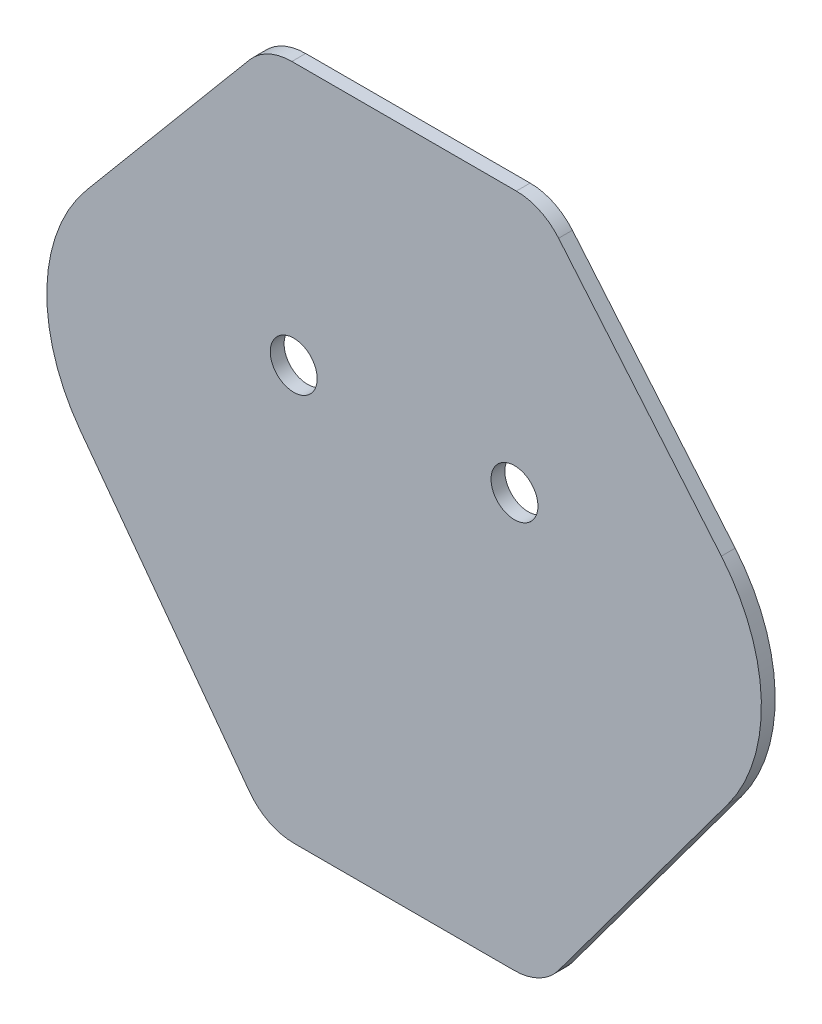
ISO-10303-21;
HEADER;
FILE_DESCRIPTION(('STEP AP214'),'2;1');
FILE_NAME('part.step','',(''),(''),'','','');
FILE_SCHEMA(('AUTOMOTIVE_DESIGN { 1 0 10303 214 1 1 1 1 }'));
ENDSEC;
DATA;
#1=APPLICATION_CONTEXT('core data for automotive mechanical design processes');
#2=APPLICATION_PROTOCOL_DEFINITION('international standard','automotive_design',2000,#1);
#3=PRODUCT_CONTEXT('',#1,'mechanical');
#4=PRODUCT('Part','Part','',(#3));
#5=PRODUCT_RELATED_PRODUCT_CATEGORY('part','',(#4));
#6=PRODUCT_DEFINITION_FORMATION('','',#4);
#7=PRODUCT_DEFINITION_CONTEXT('part definition',#1,'design');
#8=PRODUCT_DEFINITION('design','',#6,#7);
#9=PRODUCT_DEFINITION_SHAPE('','',#8);
#10=(LENGTH_UNIT() NAMED_UNIT(*) SI_UNIT(.MILLI.,.METRE.));
#11=(NAMED_UNIT(*) PLANE_ANGLE_UNIT() SI_UNIT($,.RADIAN.));
#12=(NAMED_UNIT(*) SI_UNIT($,.STERADIAN.) SOLID_ANGLE_UNIT());
#13=UNCERTAINTY_MEASURE_WITH_UNIT(LENGTH_MEASURE(1.E-05),#10,'distance_accuracy_value','');
#14=(GEOMETRIC_REPRESENTATION_CONTEXT(3) GLOBAL_UNCERTAINTY_ASSIGNED_CONTEXT((#13)) GLOBAL_UNIT_ASSIGNED_CONTEXT((#10,
#11,#12)) REPRESENTATION_CONTEXT('',''));
#15=CARTESIAN_POINT('',(0.,0.,0.));
#16=DIRECTION('',(0.,0.,1.));
#17=DIRECTION('',(1.,0.,0.));
#18=AXIS2_PLACEMENT_3D('',#15,#16,#17);
#19=CARTESIAN_POINT('',(0.,0.,3.175));
#20=DIRECTION('',(0.,0.,1.));
#21=DIRECTION('',(1.,0.,0.));
#22=AXIS2_PLACEMENT_3D('',#19,#20,#21);
#23=PLANE('',#22);
#24=CARTESIAN_POINT('',(-50.8,34.925,3.175));
#25=DIRECTION('',(0.,0.,1.));
#26=DIRECTION('',(1.,0.,0.));
#27=AXIS2_PLACEMENT_3D('',#24,#25,#26);
#28=CIRCLE('',#27,10.795);
#29=CARTESIAN_POINT('',(-40.005,34.925,3.175));
#30=VERTEX_POINT('',#29);
#31=EDGE_CURVE('E255',#30,#30,#28,.T.);
#32=ORIENTED_EDGE('',*,*,#31,.F.);
#33=EDGE_LOOP('',(#32));
#34=FACE_BOUND('',#33,.T.);
#35=DIRECTION('',(0.595437713295011,0.803401474722326,0.));
#36=VECTOR('',#35,1.);
#37=CARTESIAN_POINT('',(185.951039645285,9.64353358583404,3.175));
#38=LINE('',#37,#36);
#39=CARTESIAN_POINT('',(71.1159279285523,-145.299117917693,3.175));
#40=VERTEX_POINT('',#39);
#41=CARTESIAN_POINT('',(148.960976273407,-40.2657529767978,3.175));
#42=VERTEX_POINT('',#41);
#43=EDGE_CURVE('E154',#40,#42,#38,.T.);
#44=ORIENTED_EDGE('',*,*,#43,.T.);
#45=CARTESIAN_POINT('',(85.7011441537712,6.61901256805132,3.175));
#46=DIRECTION('',(0.,0.,1.));
#47=DIRECTION('',(1.,0.,0.));
#48=AXIS2_PLACEMENT_3D('',#45,#46,#47);
#49=CIRCLE('',#48,78.74);
#50=CARTESIAN_POINT('',(146.01948360496,57.2321089547691,3.175));
#51=VERTEX_POINT('',#50);
#52=EDGE_CURVE('E234',#42,#51,#49,.T.);
#53=ORIENTED_EDGE('',*,*,#52,.T.);
#54=DIRECTION('',(-0.642787609686535,0.766044443118982,0.));
#55=VECTOR('',#54,1.);
#56=CARTESIAN_POINT('',(63.5,155.575,3.175));
#57=LINE('',#56,#55);
#58=CARTESIAN_POINT('',(71.1133143380851,146.501805286038,3.175));
#59=VERTEX_POINT('',#58);
#60=EDGE_CURVE('E157',#51,#59,#57,.T.);
#61=ORIENTED_EDGE('',*,*,#60,.T.);
#62=CARTESIAN_POINT('',(51.6557854828629,130.175,3.175));
#63=DIRECTION('',(0.,0.,1.));
#64=DIRECTION('',(1.,0.,0.));
#65=AXIS2_PLACEMENT_3D('',#62,#63,#64);
#66=CIRCLE('',#65,25.4);
#67=CARTESIAN_POINT('',(51.6557854828629,155.575,3.175));
#68=VERTEX_POINT('',#67);
#69=EDGE_CURVE('E192',#59,#68,#66,.T.);
#70=ORIENTED_EDGE('',*,*,#69,.T.);
#71=DIRECTION('',(-1.,0.,0.));
#72=VECTOR('',#71,1.);
#73=CARTESIAN_POINT('',(63.5,155.575,3.175));
#74=LINE('',#73,#72);
#75=CARTESIAN_POINT('',(-51.6557854828629,155.575,3.175));
#76=VERTEX_POINT('',#75);
#77=EDGE_CURVE('E169',#68,#76,#74,.T.);
#78=ORIENTED_EDGE('',*,*,#77,.T.);
#79=CARTESIAN_POINT('',(-51.6557854828629,130.175,3.175));
#80=DIRECTION('',(0.,0.,1.));
#81=DIRECTION('',(1.,0.,0.));
#82=AXIS2_PLACEMENT_3D('',#79,#80,#81);
#83=CIRCLE('',#82,25.4);
#84=CARTESIAN_POINT('',(-71.1133143380851,146.501805286038,3.175));
#85=VERTEX_POINT('',#84);
#86=EDGE_CURVE('E189',#76,#85,#83,.T.);
#87=ORIENTED_EDGE('',*,*,#86,.T.);
#88=DIRECTION('',(-0.642787609686535,-0.766044443118982,0.));
#89=VECTOR('',#88,1.);
#90=CARTESIAN_POINT('',(-63.5,155.575,3.175));
#91=LINE('',#90,#89);
#92=CARTESIAN_POINT('',(-146.01948360496,57.232108954769,3.175));
#93=VERTEX_POINT('',#92);
#94=EDGE_CURVE('E266',#85,#93,#91,.T.);
#95=ORIENTED_EDGE('',*,*,#94,.T.);
#96=CARTESIAN_POINT('',(-85.7011441537711,6.61901256805127,3.175));
#97=DIRECTION('',(0.,0.,1.));
#98=DIRECTION('',(1.,0.,0.));
#99=AXIS2_PLACEMENT_3D('',#96,#97,#98);
#100=CIRCLE('',#99,78.74);
#101=CARTESIAN_POINT('',(-148.960976273407,-40.2657529767979,3.175));
#102=VERTEX_POINT('',#101);
#103=EDGE_CURVE('E59',#93,#102,#100,.T.);
#104=ORIENTED_EDGE('',*,*,#103,.T.);
#105=DIRECTION('',(0.595437713295011,-0.803401474722326,0.));
#106=VECTOR('',#105,1.);
#107=CARTESIAN_POINT('',(-185.951039645285,9.64353358583396,3.175));
#108=LINE('',#107,#106);
#109=CARTESIAN_POINT('',(-71.1159279285523,-145.299117917693,3.175));
#110=VERTEX_POINT('',#109);
#111=EDGE_CURVE('E242',#102,#110,#108,.T.);
#112=ORIENTED_EDGE('',*,*,#111,.T.);
#113=CARTESIAN_POINT('',(-50.7095304706053,-130.175,3.175));
#114=DIRECTION('',(0.,0.,1.));
#115=DIRECTION('',(1.,0.,0.));
#116=AXIS2_PLACEMENT_3D('',#113,#114,#115);
#117=CIRCLE('',#116,25.4);
#118=CARTESIAN_POINT('',(-50.7095304706053,-155.575,3.175));
#119=VERTEX_POINT('',#118);
#120=EDGE_CURVE('E195',#110,#119,#117,.T.);
#121=ORIENTED_EDGE('',*,*,#120,.T.);
#122=DIRECTION('',(1.,0.,0.));
#123=VECTOR('',#122,1.);
#124=CARTESIAN_POINT('',(63.5,-155.575,3.175));
#125=LINE('',#124,#123);
#126=CARTESIAN_POINT('',(50.7095304706053,-155.575,3.175));
#127=VERTEX_POINT('',#126);
#128=EDGE_CURVE('E260',#119,#127,#125,.T.);
#129=ORIENTED_EDGE('',*,*,#128,.T.);
#130=CARTESIAN_POINT('',(50.7095304706053,-130.175,3.175));
#131=DIRECTION('',(0.,0.,1.));
#132=DIRECTION('',(1.,0.,0.));
#133=AXIS2_PLACEMENT_3D('',#130,#131,#132);
#134=CIRCLE('',#133,25.4);
#135=EDGE_CURVE('E198',#127,#40,#134,.T.);
#136=ORIENTED_EDGE('',*,*,#135,.T.);
#137=EDGE_LOOP('',(#44,#53,#61,#70,#78,#87,#95,#104,#112,#121,#129,#136));
#138=FACE_BOUND('',#137,.T.);
#139=CARTESIAN_POINT('',(50.8,34.925,3.175));
#140=DIRECTION('',(0.,0.,1.));
#141=DIRECTION('',(1.,0.,0.));
#142=AXIS2_PLACEMENT_3D('',#139,#140,#141);
#143=CIRCLE('',#142,10.795);
#144=CARTESIAN_POINT('',(61.595,34.925,3.175));
#145=VERTEX_POINT('',#144);
#146=EDGE_CURVE('E276',#145,#145,#143,.T.);
#147=ORIENTED_EDGE('',*,*,#146,.F.);
#148=EDGE_LOOP('',(#147));
#149=FACE_BOUND('',#148,.T.);
#150=ADVANCED_FACE('F43',(#34,#138,#149),#23,.T.);
#151=CARTESIAN_POINT('',(0.,0.,-3.175));
#152=DIRECTION('',(0.,0.,1.));
#153=DIRECTION('',(1.,0.,0.));
#154=AXIS2_PLACEMENT_3D('',#151,#152,#153);
#155=PLANE('',#154);
#156=DIRECTION('',(-0.642787609686535,0.766044443118982,0.));
#157=VECTOR('',#156,1.);
#158=CARTESIAN_POINT('',(63.5,155.575,-3.175));
#159=LINE('',#158,#157);
#160=CARTESIAN_POINT('',(146.01948360496,57.2321089547691,-3.175));
#161=VERTEX_POINT('',#160);
#162=CARTESIAN_POINT('',(71.1133143380851,146.501805286038,-3.175));
#163=VERTEX_POINT('',#162);
#164=EDGE_CURVE('E164',#161,#163,#159,.T.);
#165=ORIENTED_EDGE('',*,*,#164,.F.);
#166=CARTESIAN_POINT('',(85.7011441537712,6.61901256805132,-3.175));
#167=DIRECTION('',(0.,0.,1.));
#168=DIRECTION('',(1.,0.,0.));
#169=AXIS2_PLACEMENT_3D('',#166,#167,#168);
#170=CIRCLE('',#169,78.74);
#171=CARTESIAN_POINT('',(148.960976273407,-40.2657529767978,-3.175));
#172=VERTEX_POINT('',#171);
#173=EDGE_CURVE('E162',#161,#172,#170,.F.);
#174=ORIENTED_EDGE('',*,*,#173,.T.);
#175=DIRECTION('',(0.595437713295011,0.803401474722326,0.));
#176=VECTOR('',#175,1.);
#177=CARTESIAN_POINT('',(185.951039645285,9.64353358583404,-3.175));
#178=LINE('',#177,#176);
#179=CARTESIAN_POINT('',(71.1159279285523,-145.299117917693,-3.175));
#180=VERTEX_POINT('',#179);
#181=EDGE_CURVE('E151',#180,#172,#178,.T.);
#182=ORIENTED_EDGE('',*,*,#181,.F.);
#183=CARTESIAN_POINT('',(50.7095304706053,-130.175,-3.175));
#184=DIRECTION('',(0.,0.,1.));
#185=DIRECTION('',(1.,0.,0.));
#186=AXIS2_PLACEMENT_3D('',#183,#184,#185);
#187=CIRCLE('',#186,25.4);
#188=CARTESIAN_POINT('',(50.7095304706053,-155.575,-3.175));
#189=VERTEX_POINT('',#188);
#190=EDGE_CURVE('E133',#180,#189,#187,.F.);
#191=ORIENTED_EDGE('',*,*,#190,.T.);
#192=DIRECTION('',(1.,0.,0.));
#193=VECTOR('',#192,1.);
#194=CARTESIAN_POINT('',(63.5,-155.575,-3.175));
#195=LINE('',#194,#193);
#196=CARTESIAN_POINT('',(-50.7095304706053,-155.575,-3.175));
#197=VERTEX_POINT('',#196);
#198=EDGE_CURVE('E165',#197,#189,#195,.T.);
#199=ORIENTED_EDGE('',*,*,#198,.F.);
#200=CARTESIAN_POINT('',(-50.7095304706053,-130.175,-3.175));
#201=DIRECTION('',(0.,0.,1.));
#202=DIRECTION('',(1.,0.,0.));
#203=AXIS2_PLACEMENT_3D('',#200,#201,#202);
#204=CIRCLE('',#203,25.4);
#205=CARTESIAN_POINT('',(-71.1159279285523,-145.299117917693,-3.175));
#206=VERTEX_POINT('',#205);
#207=EDGE_CURVE('E145',#197,#206,#204,.F.);
#208=ORIENTED_EDGE('',*,*,#207,.T.);
#209=DIRECTION('',(0.595437713295011,-0.803401474722326,0.));
#210=VECTOR('',#209,1.);
#211=CARTESIAN_POINT('',(-185.951039645285,9.64353358583396,-3.175));
#212=LINE('',#211,#210);
#213=CARTESIAN_POINT('',(-148.960976273407,-40.2657529767979,-3.175));
#214=VERTEX_POINT('',#213);
#215=EDGE_CURVE('E171',#214,#206,#212,.T.);
#216=ORIENTED_EDGE('',*,*,#215,.F.);
#217=CARTESIAN_POINT('',(-85.7011441537711,6.61901256805127,-3.175));
#218=DIRECTION('',(0.,0.,1.));
#219=DIRECTION('',(1.,0.,0.));
#220=AXIS2_PLACEMENT_3D('',#217,#218,#219);
#221=CIRCLE('',#220,78.74);
#222=CARTESIAN_POINT('',(-146.01948360496,57.232108954769,-3.175));
#223=VERTEX_POINT('',#222);
#224=EDGE_CURVE('E224',#214,#223,#221,.F.);
#225=ORIENTED_EDGE('',*,*,#224,.T.);
#226=DIRECTION('',(-0.642787609686535,-0.766044443118982,0.));
#227=VECTOR('',#226,1.);
#228=CARTESIAN_POINT('',(-63.5,155.575,-3.175));
#229=LINE('',#228,#227);
#230=CARTESIAN_POINT('',(-71.1133143380851,146.501805286038,-3.175));
#231=VERTEX_POINT('',#230);
#232=EDGE_CURVE('E247',#231,#223,#229,.T.);
#233=ORIENTED_EDGE('',*,*,#232,.F.);
#234=CARTESIAN_POINT('',(-51.6557854828629,130.175,-3.175));
#235=DIRECTION('',(0.,0.,1.));
#236=DIRECTION('',(1.,0.,0.));
#237=AXIS2_PLACEMENT_3D('',#234,#235,#236);
#238=CIRCLE('',#237,25.4);
#239=CARTESIAN_POINT('',(-51.6557854828629,155.575,-3.175));
#240=VERTEX_POINT('',#239);
#241=EDGE_CURVE('E156',#231,#240,#238,.F.);
#242=ORIENTED_EDGE('',*,*,#241,.T.);
#243=DIRECTION('',(-1.,0.,0.));
#244=VECTOR('',#243,1.);
#245=CARTESIAN_POINT('',(63.5,155.575,-3.175));
#246=LINE('',#245,#244);
#247=CARTESIAN_POINT('',(51.6557854828629,155.575,-3.175));
#248=VERTEX_POINT('',#247);
#249=EDGE_CURVE('E249',#248,#240,#246,.T.);
#250=ORIENTED_EDGE('',*,*,#249,.F.);
#251=CARTESIAN_POINT('',(51.6557854828629,130.175,-3.175));
#252=DIRECTION('',(0.,0.,1.));
#253=DIRECTION('',(1.,0.,0.));
#254=AXIS2_PLACEMENT_3D('',#251,#252,#253);
#255=CIRCLE('',#254,25.4);
#256=EDGE_CURVE('E177',#248,#163,#255,.F.);
#257=ORIENTED_EDGE('',*,*,#256,.T.);
#258=EDGE_LOOP('',(#165,#174,#182,#191,#199,#208,#216,#225,#233,#242,#250,#257));
#259=FACE_BOUND('',#258,.T.);
#260=CARTESIAN_POINT('',(-50.8,34.925,-3.175));
#261=DIRECTION('',(0.,0.,1.));
#262=DIRECTION('',(1.,0.,0.));
#263=AXIS2_PLACEMENT_3D('',#260,#261,#262);
#264=CIRCLE('',#263,10.795);
#265=CARTESIAN_POINT('',(-40.005,34.925,-3.175));
#266=VERTEX_POINT('',#265);
#267=EDGE_CURVE('E272',#266,#266,#264,.T.);
#268=ORIENTED_EDGE('',*,*,#267,.T.);
#269=EDGE_LOOP('',(#268));
#270=FACE_BOUND('',#269,.T.);
#271=CARTESIAN_POINT('',(50.8,34.925,-3.175));
#272=DIRECTION('',(0.,0.,1.));
#273=DIRECTION('',(1.,0.,0.));
#274=AXIS2_PLACEMENT_3D('',#271,#272,#273);
#275=CIRCLE('',#274,10.795);
#276=CARTESIAN_POINT('',(61.595,34.925,-3.175));
#277=VERTEX_POINT('',#276);
#278=EDGE_CURVE('E280',#277,#277,#275,.T.);
#279=ORIENTED_EDGE('',*,*,#278,.T.);
#280=EDGE_LOOP('',(#279));
#281=FACE_BOUND('',#280,.T.);
#282=ADVANCED_FACE('F160',(#259,#270,#281),#155,.F.);
#283=CARTESIAN_POINT('',(63.5,155.575,3.175));
#284=DIRECTION('',(0.,-1.,0.));
#285=DIRECTION('',(1.,0.,0.));
#286=AXIS2_PLACEMENT_3D('',#283,#284,#285);
#287=PLANE('',#286);
#288=ORIENTED_EDGE('',*,*,#77,.F.);
#289=DIRECTION('',(0.,0.,-1.));
#290=VECTOR('',#289,1.);
#291=CARTESIAN_POINT('',(51.6557854828629,155.575,3.175));
#292=LINE('',#291,#290);
#293=EDGE_CURVE('E208',#68,#248,#292,.T.);
#294=ORIENTED_EDGE('',*,*,#293,.T.);
#295=ORIENTED_EDGE('',*,*,#249,.T.);
#296=DIRECTION('',(0.,0.,-1.));
#297=VECTOR('',#296,1.);
#298=CARTESIAN_POINT('',(-51.6557854828629,155.575,3.175));
#299=LINE('',#298,#297);
#300=EDGE_CURVE('E205',#240,#76,#299,.F.);
#301=ORIENTED_EDGE('',*,*,#300,.T.);
#302=EDGE_LOOP('',(#288,#294,#295,#301));
#303=FACE_BOUND('',#302,.T.);
#304=ADVANCED_FACE('F297',(#303),#287,.F.);
#305=CARTESIAN_POINT('',(-63.5,155.575,3.175));
#306=DIRECTION('',(0.766044443118982,-0.642787609686535,0.));
#307=DIRECTION('',(0.642787609686535,0.766044443118982,0.));
#308=AXIS2_PLACEMENT_3D('',#305,#306,#307);
#309=PLANE('',#308);
#310=ORIENTED_EDGE('',*,*,#232,.T.);
#311=DIRECTION('',(0.,0.,-1.));
#312=VECTOR('',#311,1.);
#313=CARTESIAN_POINT('',(-146.01948360496,57.232108954769,3.175));
#314=LINE('',#313,#312);
#315=EDGE_CURVE('E11',#223,#93,#314,.F.);
#316=ORIENTED_EDGE('',*,*,#315,.T.);
#317=ORIENTED_EDGE('',*,*,#94,.F.);
#318=DIRECTION('',(0.,0.,-1.));
#319=VECTOR('',#318,1.);
#320=CARTESIAN_POINT('',(-71.1133143380851,146.501805286038,3.175));
#321=LINE('',#320,#319);
#322=EDGE_CURVE('E216',#85,#231,#321,.T.);
#323=ORIENTED_EDGE('',*,*,#322,.T.);
#324=EDGE_LOOP('',(#310,#316,#317,#323));
#325=FACE_BOUND('',#324,.T.);
#326=ADVANCED_FACE('F316',(#325),#309,.F.);
#327=CARTESIAN_POINT('',(-185.951039645285,9.64353358583396,3.175));
#328=DIRECTION('',(0.803401474722326,0.595437713295011,0.));
#329=DIRECTION('',(-0.595437713295011,0.803401474722326,0.));
#330=AXIS2_PLACEMENT_3D('',#327,#328,#329);
#331=PLANE('',#330);
#332=ORIENTED_EDGE('',*,*,#111,.F.);
#333=DIRECTION('',(0.,0.,-1.));
#334=VECTOR('',#333,1.);
#335=CARTESIAN_POINT('',(-148.960976273407,-40.2657529767979,3.175));
#336=LINE('',#335,#334);
#337=EDGE_CURVE('E52',#102,#214,#336,.T.);
#338=ORIENTED_EDGE('',*,*,#337,.T.);
#339=ORIENTED_EDGE('',*,*,#215,.T.);
#340=DIRECTION('',(0.,0.,-1.));
#341=VECTOR('',#340,1.);
#342=CARTESIAN_POINT('',(-71.1159279285523,-145.299117917693,3.175));
#343=LINE('',#342,#341);
#344=EDGE_CURVE('E201',#206,#110,#343,.F.);
#345=ORIENTED_EDGE('',*,*,#344,.T.);
#346=EDGE_LOOP('',(#332,#338,#339,#345));
#347=FACE_BOUND('',#346,.T.);
#348=ADVANCED_FACE('F241',(#347),#331,.F.);
#349=CARTESIAN_POINT('',(63.5,-155.575,3.175));
#350=DIRECTION('',(0.,1.,0.));
#351=DIRECTION('',(-1.,0.,0.));
#352=AXIS2_PLACEMENT_3D('',#349,#350,#351);
#353=PLANE('',#352);
#354=ORIENTED_EDGE('',*,*,#198,.T.);
#355=DIRECTION('',(0.,0.,-1.));
#356=VECTOR('',#355,1.);
#357=CARTESIAN_POINT('',(50.7095304706053,-155.575,3.175));
#358=LINE('',#357,#356);
#359=EDGE_CURVE('E138',#189,#127,#358,.F.);
#360=ORIENTED_EDGE('',*,*,#359,.T.);
#361=ORIENTED_EDGE('',*,*,#128,.F.);
#362=DIRECTION('',(0.,0.,-1.));
#363=VECTOR('',#362,1.);
#364=CARTESIAN_POINT('',(-50.7095304706053,-155.575,3.175));
#365=LINE('',#364,#363);
#366=EDGE_CURVE('E144',#119,#197,#365,.T.);
#367=ORIENTED_EDGE('',*,*,#366,.T.);
#368=EDGE_LOOP('',(#354,#360,#361,#367));
#369=FACE_BOUND('',#368,.T.);
#370=ADVANCED_FACE('F310',(#369),#353,.F.);
#371=CARTESIAN_POINT('',(185.951039645285,9.64353358583404,3.175));
#372=DIRECTION('',(-0.803401474722326,0.595437713295011,0.));
#373=DIRECTION('',(-0.595437713295011,-0.803401474722326,0.));
#374=AXIS2_PLACEMENT_3D('',#371,#372,#373);
#375=PLANE('',#374);
#376=ORIENTED_EDGE('',*,*,#181,.T.);
#377=DIRECTION('',(0.,0.,-1.));
#378=VECTOR('',#377,1.);
#379=CARTESIAN_POINT('',(148.960976273407,-40.2657529767978,3.175));
#380=LINE('',#379,#378);
#381=EDGE_CURVE('E229',#172,#42,#380,.F.);
#382=ORIENTED_EDGE('',*,*,#381,.T.);
#383=ORIENTED_EDGE('',*,*,#43,.F.);
#384=DIRECTION('',(0.,0.,-1.));
#385=VECTOR('',#384,1.);
#386=CARTESIAN_POINT('',(71.1159279285523,-145.299117917693,3.175));
#387=LINE('',#386,#385);
#388=EDGE_CURVE('E137',#40,#180,#387,.T.);
#389=ORIENTED_EDGE('',*,*,#388,.T.);
#390=EDGE_LOOP('',(#376,#382,#383,#389));
#391=FACE_BOUND('',#390,.T.);
#392=ADVANCED_FACE('F150',(#391),#375,.F.);
#393=CARTESIAN_POINT('',(63.5,155.575,3.175));
#394=DIRECTION('',(-0.766044443118982,-0.642787609686535,0.));
#395=DIRECTION('',(0.642787609686535,-0.766044443118982,0.));
#396=AXIS2_PLACEMENT_3D('',#393,#394,#395);
#397=PLANE('',#396);
#398=ORIENTED_EDGE('',*,*,#60,.F.);
#399=DIRECTION('',(0.,0.,-1.));
#400=VECTOR('',#399,1.);
#401=CARTESIAN_POINT('',(146.01948360496,57.2321089547691,3.175));
#402=LINE('',#401,#400);
#403=EDGE_CURVE('E220',#51,#161,#402,.T.);
#404=ORIENTED_EDGE('',*,*,#403,.T.);
#405=ORIENTED_EDGE('',*,*,#164,.T.);
#406=DIRECTION('',(0.,0.,-1.));
#407=VECTOR('',#406,1.);
#408=CARTESIAN_POINT('',(71.1133143380851,146.501805286038,3.175));
#409=LINE('',#408,#407);
#410=EDGE_CURVE('E212',#163,#59,#409,.F.);
#411=ORIENTED_EDGE('',*,*,#410,.T.);
#412=EDGE_LOOP('',(#398,#404,#405,#411));
#413=FACE_BOUND('',#412,.T.);
#414=ADVANCED_FACE('F304',(#413),#397,.F.);
#415=CARTESIAN_POINT('',(-50.8,34.925,3.175));
#416=DIRECTION('',(0.,0.,-1.));
#417=DIRECTION('',(-1.,0.,0.));
#418=AXIS2_PLACEMENT_3D('',#415,#416,#417);
#419=CYLINDRICAL_SURFACE('',#418,10.795);
#420=ORIENTED_EDGE('',*,*,#31,.T.);
#421=EDGE_LOOP('',(#420));
#422=FACE_BOUND('',#421,.T.);
#423=ORIENTED_EDGE('',*,*,#267,.F.);
#424=EDGE_LOOP('',(#423));
#425=FACE_BOUND('',#424,.T.);
#426=ADVANCED_FACE('F301',(#422,#425),#419,.F.);
#427=CARTESIAN_POINT('',(50.8,34.925,3.175));
#428=DIRECTION('',(0.,0.,-1.));
#429=DIRECTION('',(-1.,0.,0.));
#430=AXIS2_PLACEMENT_3D('',#427,#428,#429);
#431=CYLINDRICAL_SURFACE('',#430,10.795);
#432=ORIENTED_EDGE('',*,*,#146,.T.);
#433=EDGE_LOOP('',(#432));
#434=FACE_BOUND('',#433,.T.);
#435=ORIENTED_EDGE('',*,*,#278,.F.);
#436=EDGE_LOOP('',(#435));
#437=FACE_BOUND('',#436,.T.);
#438=ADVANCED_FACE('F288',(#434,#437),#431,.F.);
#439=CARTESIAN_POINT('',(50.7095304706053,-130.175,3.175));
#440=DIRECTION('',(0.,0.,-1.));
#441=DIRECTION('',(-1.,0.,0.));
#442=AXIS2_PLACEMENT_3D('',#439,#440,#441);
#443=CYLINDRICAL_SURFACE('',#442,25.4);
#444=ORIENTED_EDGE('',*,*,#135,.F.);
#445=ORIENTED_EDGE('',*,*,#359,.F.);
#446=ORIENTED_EDGE('',*,*,#190,.F.);
#447=ORIENTED_EDGE('',*,*,#388,.F.);
#448=EDGE_LOOP('',(#444,#445,#446,#447));
#449=FACE_BOUND('',#448,.T.);
#450=ADVANCED_FACE('F136',(#449),#443,.T.);
#451=CARTESIAN_POINT('',(-50.7095304706053,-130.175,3.175));
#452=DIRECTION('',(0.,0.,-1.));
#453=DIRECTION('',(-1.,0.,0.));
#454=AXIS2_PLACEMENT_3D('',#451,#452,#453);
#455=CYLINDRICAL_SURFACE('',#454,25.4);
#456=ORIENTED_EDGE('',*,*,#120,.F.);
#457=ORIENTED_EDGE('',*,*,#344,.F.);
#458=ORIENTED_EDGE('',*,*,#207,.F.);
#459=ORIENTED_EDGE('',*,*,#366,.F.);
#460=EDGE_LOOP('',(#456,#457,#458,#459));
#461=FACE_BOUND('',#460,.T.);
#462=ADVANCED_FACE('F324',(#461),#455,.T.);
#463=CARTESIAN_POINT('',(51.6557854828629,130.175,3.175));
#464=DIRECTION('',(0.,0.,-1.));
#465=DIRECTION('',(-1.,0.,0.));
#466=AXIS2_PLACEMENT_3D('',#463,#464,#465);
#467=CYLINDRICAL_SURFACE('',#466,25.4);
#468=ORIENTED_EDGE('',*,*,#69,.F.);
#469=ORIENTED_EDGE('',*,*,#410,.F.);
#470=ORIENTED_EDGE('',*,*,#256,.F.);
#471=ORIENTED_EDGE('',*,*,#293,.F.);
#472=EDGE_LOOP('',(#468,#469,#470,#471));
#473=FACE_BOUND('',#472,.T.);
#474=ADVANCED_FACE('F327',(#473),#467,.T.);
#475=CARTESIAN_POINT('',(-51.6557854828629,130.175,3.175));
#476=DIRECTION('',(0.,0.,-1.));
#477=DIRECTION('',(-1.,0.,0.));
#478=AXIS2_PLACEMENT_3D('',#475,#476,#477);
#479=CYLINDRICAL_SURFACE('',#478,25.4);
#480=ORIENTED_EDGE('',*,*,#86,.F.);
#481=ORIENTED_EDGE('',*,*,#300,.F.);
#482=ORIENTED_EDGE('',*,*,#241,.F.);
#483=ORIENTED_EDGE('',*,*,#322,.F.);
#484=EDGE_LOOP('',(#480,#481,#482,#483));
#485=FACE_BOUND('',#484,.T.);
#486=ADVANCED_FACE('F331',(#485),#479,.T.);
#487=CARTESIAN_POINT('',(85.7011441537712,6.61901256805132,3.175));
#488=DIRECTION('',(0.,0.,-1.));
#489=DIRECTION('',(-1.,0.,0.));
#490=AXIS2_PLACEMENT_3D('',#487,#488,#489);
#491=CYLINDRICAL_SURFACE('',#490,78.74);
#492=ORIENTED_EDGE('',*,*,#52,.F.);
#493=ORIENTED_EDGE('',*,*,#381,.F.);
#494=ORIENTED_EDGE('',*,*,#173,.F.);
#495=ORIENTED_EDGE('',*,*,#403,.F.);
#496=EDGE_LOOP('',(#492,#493,#494,#495));
#497=FACE_BOUND('',#496,.T.);
#498=ADVANCED_FACE('F334',(#497),#491,.T.);
#499=CARTESIAN_POINT('',(-85.7011441537711,6.61901256805127,3.175));
#500=DIRECTION('',(0.,0.,-1.));
#501=DIRECTION('',(-1.,0.,0.));
#502=AXIS2_PLACEMENT_3D('',#499,#500,#501);
#503=CYLINDRICAL_SURFACE('',#502,78.74);
#504=ORIENTED_EDGE('',*,*,#103,.F.);
#505=ORIENTED_EDGE('',*,*,#315,.F.);
#506=ORIENTED_EDGE('',*,*,#224,.F.);
#507=ORIENTED_EDGE('',*,*,#337,.F.);
#508=EDGE_LOOP('',(#504,#505,#506,#507));
#509=FACE_BOUND('',#508,.T.);
#510=ADVANCED_FACE('F45',(#509),#503,.T.);
#511=CLOSED_SHELL('',(#150,#282,#304,#326,#348,#370,#392,#414,#426,#438,#450,#462,#474,#486,
#498,#510));
#512=MANIFOLD_SOLID_BREP('B2',#511);
#513=ADVANCED_BREP_SHAPE_REPRESENTATION('',(#18,#512),#14);
#514=SHAPE_DEFINITION_REPRESENTATION(#9,#513);
ENDSEC;
END-ISO-10303-21;
